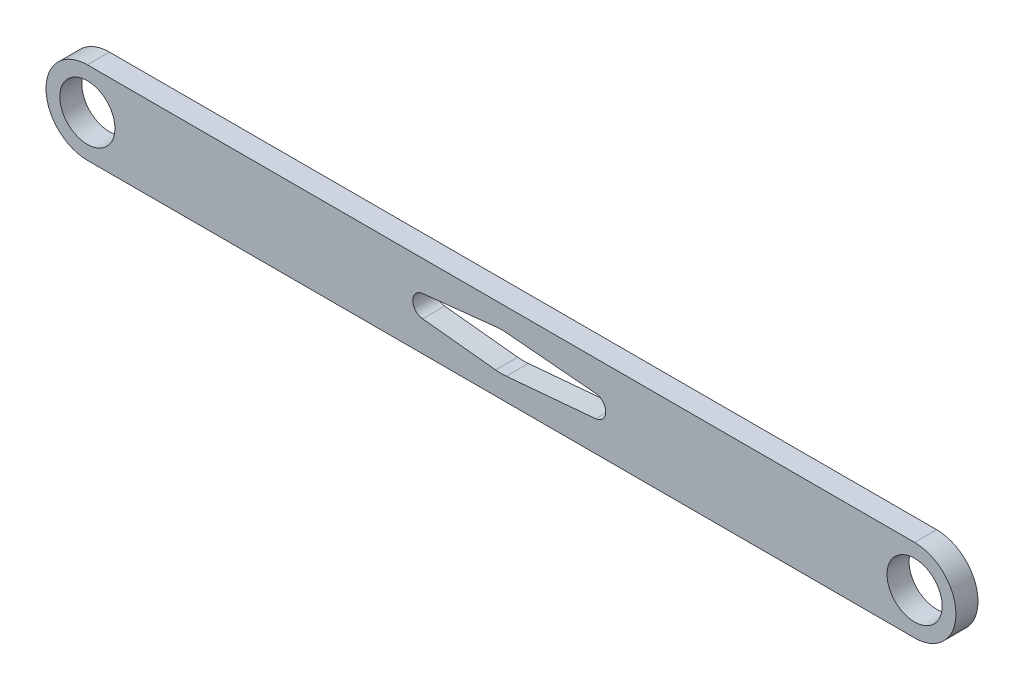
ISO-10303-21;
HEADER;
FILE_DESCRIPTION(('STEP AP214'),'2;1');
FILE_NAME('part.step','',(''),(''),'','','');
FILE_SCHEMA(('AUTOMOTIVE_DESIGN { 1 0 10303 214 1 1 1 1 }'));
ENDSEC;
DATA;
#1=APPLICATION_CONTEXT('core data for automotive mechanical design processes');
#2=APPLICATION_PROTOCOL_DEFINITION('international standard','automotive_design',2000,#1);
#3=PRODUCT_CONTEXT('',#1,'mechanical');
#4=PRODUCT('Part','Part','',(#3));
#5=PRODUCT_RELATED_PRODUCT_CATEGORY('part','',(#4));
#6=PRODUCT_DEFINITION_FORMATION('','',#4);
#7=PRODUCT_DEFINITION_CONTEXT('part definition',#1,'design');
#8=PRODUCT_DEFINITION('design','',#6,#7);
#9=PRODUCT_DEFINITION_SHAPE('','',#8);
#10=(LENGTH_UNIT() NAMED_UNIT(*) SI_UNIT(.MILLI.,.METRE.));
#11=(NAMED_UNIT(*) PLANE_ANGLE_UNIT() SI_UNIT($,.RADIAN.));
#12=(NAMED_UNIT(*) SI_UNIT($,.STERADIAN.) SOLID_ANGLE_UNIT());
#13=UNCERTAINTY_MEASURE_WITH_UNIT(LENGTH_MEASURE(1.E-05),#10,'distance_accuracy_value','');
#14=(GEOMETRIC_REPRESENTATION_CONTEXT(3) GLOBAL_UNCERTAINTY_ASSIGNED_CONTEXT((#13)) GLOBAL_UNIT_ASSIGNED_CONTEXT((#10,
#11,#12)) REPRESENTATION_CONTEXT('',''));
#15=CARTESIAN_POINT('',(0.,0.,0.));
#16=DIRECTION('',(0.,0.,1.));
#17=DIRECTION('',(1.,0.,0.));
#18=AXIS2_PLACEMENT_3D('',#15,#16,#17);
#19=CARTESIAN_POINT('',(75.,0.,4.));
#20=DIRECTION('',(0.,0.,1.));
#21=DIRECTION('',(1.,0.,0.));
#22=AXIS2_PLACEMENT_3D('',#19,#20,#21);
#23=PLANE('',#22);
#24=CARTESIAN_POINT('',(75.,0.,4.));
#25=DIRECTION('',(0.,0.,1.));
#26=DIRECTION('',(1.,0.,0.));
#27=AXIS2_PLACEMENT_3D('',#24,#25,#26);
#28=CIRCLE('',#27,5.);
#29=CARTESIAN_POINT('',(80.,0.,4.));
#30=VERTEX_POINT('',#29);
#31=EDGE_CURVE('E197',#30,#30,#28,.T.);
#32=ORIENTED_EDGE('',*,*,#31,.F.);
#33=EDGE_LOOP('',(#32));
#34=FACE_BOUND('',#33,.T.);
#35=CARTESIAN_POINT('',(75.,0.,4.));
#36=DIRECTION('',(0.,0.,1.));
#37=DIRECTION('',(1.,0.,0.));
#38=AXIS2_PLACEMENT_3D('',#35,#36,#37);
#39=CIRCLE('',#38,7.5);
#40=CARTESIAN_POINT('',(75.,-7.50000000000002,4.));
#41=VERTEX_POINT('',#40);
#42=CARTESIAN_POINT('',(75.,7.49999999999998,4.));
#43=VERTEX_POINT('',#42);
#44=EDGE_CURVE('E203',#41,#43,#39,.T.);
#45=ORIENTED_EDGE('',*,*,#44,.T.);
#46=DIRECTION('',(-1.,0.,0.));
#47=VECTOR('',#46,1.);
#48=CARTESIAN_POINT('',(75.,7.49999999999998,4.));
#49=LINE('',#48,#47);
#50=CARTESIAN_POINT('',(-75.,7.50000000000003,4.));
#51=VERTEX_POINT('',#50);
#52=EDGE_CURVE('E206',#43,#51,#49,.T.);
#53=ORIENTED_EDGE('',*,*,#52,.T.);
#54=CARTESIAN_POINT('',(-75.,0.,4.));
#55=DIRECTION('',(0.,0.,1.));
#56=DIRECTION('',(1.,0.,0.));
#57=AXIS2_PLACEMENT_3D('',#54,#55,#56);
#58=CIRCLE('',#57,7.5);
#59=CARTESIAN_POINT('',(-75.,-7.50000000000004,4.));
#60=VERTEX_POINT('',#59);
#61=EDGE_CURVE('E209',#51,#60,#58,.T.);
#62=ORIENTED_EDGE('',*,*,#61,.T.);
#63=DIRECTION('',(1.,0.,0.));
#64=VECTOR('',#63,1.);
#65=CARTESIAN_POINT('',(75.,-7.50000000000002,4.));
#66=LINE('',#65,#64);
#67=EDGE_CURVE('E211',#60,#41,#66,.T.);
#68=ORIENTED_EDGE('',*,*,#67,.T.);
#69=EDGE_LOOP('',(#45,#53,#62,#68));
#70=FACE_BOUND('',#69,.T.);
#71=CARTESIAN_POINT('',(-75.,0.,4.));
#72=DIRECTION('',(0.,0.,1.));
#73=DIRECTION('',(-1.,0.,0.));
#74=AXIS2_PLACEMENT_3D('',#71,#72,#73);
#75=CIRCLE('',#74,5.);
#76=CARTESIAN_POINT('',(-80.,0.,4.));
#77=VERTEX_POINT('',#76);
#78=EDGE_CURVE('E191',#77,#77,#75,.T.);
#79=ORIENTED_EDGE('',*,*,#78,.F.);
#80=EDGE_LOOP('',(#79));
#81=FACE_BOUND('',#80,.T.);
#82=DIRECTION('',(-0.994393675829005,-0.105741276100109,0.));
#83=VECTOR('',#82,1.);
#84=CARTESIAN_POINT('',(-0.965077795265282,3.39737609953909,4.));
#85=LINE('',#84,#83);
#86=CARTESIAN_POINT('',(-0.965077795265282,3.39737609953909,4.));
#87=VERTEX_POINT('',#86);
#88=CARTESIAN_POINT('',(-14.2114825522002,1.988787351658,4.));
#89=VERTEX_POINT('',#88);
#90=EDGE_CURVE('E134',#87,#89,#85,.T.);
#91=ORIENTED_EDGE('',*,*,#90,.F.);
#92=CARTESIAN_POINT('',(0.0923349657358066,-6.54656065875096,4.));
#93=DIRECTION('',(0.,0.,1.));
#94=DIRECTION('',(1.,0.,0.));
#95=AXIS2_PLACEMENT_3D('',#92,#93,#94);
#96=CIRCLE('',#95,10.);
#97=CARTESIAN_POINT('',(0.966800983112849,3.41513142565181,4.));
#98=VERTEX_POINT('',#97);
#99=EDGE_CURVE('E126',#98,#87,#96,.T.);
#100=ORIENTED_EDGE('',*,*,#99,.F.);
#101=DIRECTION('',(-0.996169208440277,0.0874466017377044,0.));
#102=VECTOR('',#101,1.);
#103=CARTESIAN_POINT('',(0.966800983112849,3.41513142565181,4.));
#104=LINE('',#103,#102);
#105=CARTESIAN_POINT('',(17.1748932034754,1.99233841688055,4.));
#106=VERTEX_POINT('',#105);
#107=EDGE_CURVE('E159',#106,#98,#104,.T.);
#108=ORIENTED_EDGE('',*,*,#107,.F.);
#109=CARTESIAN_POINT('',(17.,0.,4.));
#110=DIRECTION('',(0.,0.,1.));
#111=DIRECTION('',(-1.,0.,0.));
#112=AXIS2_PLACEMENT_3D('',#109,#110,#111);
#113=CIRCLE('',#112,2.);
#114=CARTESIAN_POINT('',(17.1748932034754,-1.99233841688056,4.));
#115=VERTEX_POINT('',#114);
#116=EDGE_CURVE('E157',#115,#106,#113,.T.);
#117=ORIENTED_EDGE('',*,*,#116,.F.);
#118=DIRECTION('',(0.996169208440277,0.0874466017377038,0.));
#119=VECTOR('',#118,1.);
#120=CARTESIAN_POINT('',(0.966800983112841,-3.41513142565181,4.));
#121=LINE('',#120,#119);
#122=CARTESIAN_POINT('',(0.966800983112841,-3.41513142565181,4.));
#123=VERTEX_POINT('',#122);
#124=EDGE_CURVE('E155',#123,#115,#121,.T.);
#125=ORIENTED_EDGE('',*,*,#124,.F.);
#126=CARTESIAN_POINT('',(0.0923349657358031,6.54656065875096,4.));
#127=DIRECTION('',(0.,0.,1.));
#128=DIRECTION('',(1.,0.,0.));
#129=AXIS2_PLACEMENT_3D('',#126,#127,#128);
#130=CIRCLE('',#129,10.);
#131=CARTESIAN_POINT('',(-0.965077795265273,-3.3973760995391,4.));
#132=VERTEX_POINT('',#131);
#133=EDGE_CURVE('E153',#132,#123,#130,.T.);
#134=ORIENTED_EDGE('',*,*,#133,.F.);
#135=DIRECTION('',(0.994393675829005,-0.105741276100108,0.));
#136=VECTOR('',#135,1.);
#137=CARTESIAN_POINT('',(-0.965077795265276,-3.3973760995391,4.));
#138=LINE('',#137,#136);
#139=CARTESIAN_POINT('',(-14.2114825522002,-1.98878735165802,4.));
#140=VERTEX_POINT('',#139);
#141=EDGE_CURVE('E149',#140,#132,#138,.T.);
#142=ORIENTED_EDGE('',*,*,#141,.F.);
#143=CARTESIAN_POINT('',(-14.,0.,4.));
#144=DIRECTION('',(0.,0.,1.));
#145=DIRECTION('',(1.,0.,0.));
#146=AXIS2_PLACEMENT_3D('',#143,#144,#145);
#147=CIRCLE('',#146,2.);
#148=EDGE_CURVE('E147',#89,#140,#147,.T.);
#149=ORIENTED_EDGE('',*,*,#148,.F.);
#150=EDGE_LOOP('',(#91,#100,#108,#117,#125,#134,#142,#149));
#151=FACE_BOUND('',#150,.T.);
#152=ADVANCED_FACE('F37',(#34,#70,#81,#151),#23,.T.);
#153=CARTESIAN_POINT('',(75.,0.,0.));
#154=DIRECTION('',(0.,0.,1.));
#155=DIRECTION('',(1.,0.,0.));
#156=AXIS2_PLACEMENT_3D('',#153,#154,#155);
#157=PLANE('',#156);
#158=CARTESIAN_POINT('',(-75.,0.,0.));
#159=DIRECTION('',(0.,0.,1.));
#160=DIRECTION('',(-1.,0.,0.));
#161=AXIS2_PLACEMENT_3D('',#158,#159,#160);
#162=CIRCLE('',#161,5.);
#163=CARTESIAN_POINT('',(-80.,0.,0.));
#164=VERTEX_POINT('',#163);
#165=EDGE_CURVE('E142',#164,#164,#162,.T.);
#166=ORIENTED_EDGE('',*,*,#165,.T.);
#167=EDGE_LOOP('',(#166));
#168=FACE_BOUND('',#167,.T.);
#169=CARTESIAN_POINT('',(75.,0.,0.));
#170=DIRECTION('',(0.,0.,1.));
#171=DIRECTION('',(1.,0.,0.));
#172=AXIS2_PLACEMENT_3D('',#169,#170,#171);
#173=CIRCLE('',#172,5.);
#174=CARTESIAN_POINT('',(80.,0.,0.));
#175=VERTEX_POINT('',#174);
#176=EDGE_CURVE('E194',#175,#175,#173,.T.);
#177=ORIENTED_EDGE('',*,*,#176,.T.);
#178=EDGE_LOOP('',(#177));
#179=FACE_BOUND('',#178,.T.);
#180=CARTESIAN_POINT('',(75.,0.,0.));
#181=DIRECTION('',(0.,0.,1.));
#182=DIRECTION('',(1.,0.,0.));
#183=AXIS2_PLACEMENT_3D('',#180,#181,#182);
#184=CIRCLE('',#183,7.5);
#185=CARTESIAN_POINT('',(75.,-7.50000000000002,0.));
#186=VERTEX_POINT('',#185);
#187=CARTESIAN_POINT('',(75.,7.49999999999998,0.));
#188=VERTEX_POINT('',#187);
#189=EDGE_CURVE('E200',#186,#188,#184,.T.);
#190=ORIENTED_EDGE('',*,*,#189,.F.);
#191=DIRECTION('',(1.,0.,0.));
#192=VECTOR('',#191,1.);
#193=CARTESIAN_POINT('',(75.,-7.50000000000002,0.));
#194=LINE('',#193,#192);
#195=CARTESIAN_POINT('',(-75.,-7.50000000000004,0.));
#196=VERTEX_POINT('',#195);
#197=EDGE_CURVE('E207',#196,#186,#194,.T.);
#198=ORIENTED_EDGE('',*,*,#197,.F.);
#199=CARTESIAN_POINT('',(-75.,0.,0.));
#200=DIRECTION('',(0.,0.,1.));
#201=DIRECTION('',(1.,0.,0.));
#202=AXIS2_PLACEMENT_3D('',#199,#200,#201);
#203=CIRCLE('',#202,7.5);
#204=CARTESIAN_POINT('',(-75.,7.50000000000003,0.));
#205=VERTEX_POINT('',#204);
#206=EDGE_CURVE('E218',#205,#196,#203,.T.);
#207=ORIENTED_EDGE('',*,*,#206,.F.);
#208=DIRECTION('',(-1.,0.,0.));
#209=VECTOR('',#208,1.);
#210=CARTESIAN_POINT('',(75.,7.49999999999998,0.));
#211=LINE('',#210,#209);
#212=EDGE_CURVE('E216',#188,#205,#211,.T.);
#213=ORIENTED_EDGE('',*,*,#212,.F.);
#214=EDGE_LOOP('',(#190,#198,#207,#213));
#215=FACE_BOUND('',#214,.T.);
#216=CARTESIAN_POINT('',(0.0923349657358066,-6.54656065875096,0.));
#217=DIRECTION('',(0.,0.,1.));
#218=DIRECTION('',(1.,0.,0.));
#219=AXIS2_PLACEMENT_3D('',#216,#217,#218);
#220=CIRCLE('',#219,10.);
#221=CARTESIAN_POINT('',(0.966800983112831,3.41513142565182,0.));
#222=VERTEX_POINT('',#221);
#223=CARTESIAN_POINT('',(-0.965077795265282,3.39737609953909,0.));
#224=VERTEX_POINT('',#223);
#225=EDGE_CURVE('E60',#222,#224,#220,.T.);
#226=ORIENTED_EDGE('',*,*,#225,.T.);
#227=DIRECTION('',(-0.994393675829005,-0.105741276100109,0.));
#228=VECTOR('',#227,1.);
#229=CARTESIAN_POINT('',(-0.965077795265282,3.39737609953909,0.));
#230=LINE('',#229,#228);
#231=CARTESIAN_POINT('',(-14.2114825522002,1.988787351658,0.));
#232=VERTEX_POINT('',#231);
#233=EDGE_CURVE('E141',#224,#232,#230,.T.);
#234=ORIENTED_EDGE('',*,*,#233,.T.);
#235=CARTESIAN_POINT('',(-14.,0.,0.));
#236=DIRECTION('',(0.,0.,1.));
#237=DIRECTION('',(1.,0.,0.));
#238=AXIS2_PLACEMENT_3D('',#235,#236,#237);
#239=CIRCLE('',#238,2.);
#240=CARTESIAN_POINT('',(-14.2114825522002,-1.98878735165802,0.));
#241=VERTEX_POINT('',#240);
#242=EDGE_CURVE('E163',#232,#241,#239,.T.);
#243=ORIENTED_EDGE('',*,*,#242,.T.);
#244=DIRECTION('',(0.994393675829005,-0.105741276100108,0.));
#245=VECTOR('',#244,1.);
#246=CARTESIAN_POINT('',(-0.965077795265276,-3.3973760995391,0.));
#247=LINE('',#246,#245);
#248=CARTESIAN_POINT('',(-0.965077795265273,-3.3973760995391,0.));
#249=VERTEX_POINT('',#248);
#250=EDGE_CURVE('E166',#241,#249,#247,.T.);
#251=ORIENTED_EDGE('',*,*,#250,.T.);
#252=CARTESIAN_POINT('',(0.0923349657358031,6.54656065875096,0.));
#253=DIRECTION('',(0.,0.,1.));
#254=DIRECTION('',(1.,0.,0.));
#255=AXIS2_PLACEMENT_3D('',#252,#253,#254);
#256=CIRCLE('',#255,10.);
#257=CARTESIAN_POINT('',(0.966800983112841,-3.41513142565181,0.));
#258=VERTEX_POINT('',#257);
#259=EDGE_CURVE('E169',#249,#258,#256,.T.);
#260=ORIENTED_EDGE('',*,*,#259,.T.);
#261=DIRECTION('',(0.996169208440277,0.0874466017377038,0.));
#262=VECTOR('',#261,1.);
#263=CARTESIAN_POINT('',(0.966800983112841,-3.41513142565181,0.));
#264=LINE('',#263,#262);
#265=CARTESIAN_POINT('',(17.1748932034754,-1.99233841688056,0.));
#266=VERTEX_POINT('',#265);
#267=EDGE_CURVE('E172',#258,#266,#264,.T.);
#268=ORIENTED_EDGE('',*,*,#267,.T.);
#269=CARTESIAN_POINT('',(17.,0.,0.));
#270=DIRECTION('',(0.,0.,1.));
#271=DIRECTION('',(-1.,0.,0.));
#272=AXIS2_PLACEMENT_3D('',#269,#270,#271);
#273=CIRCLE('',#272,2.);
#274=CARTESIAN_POINT('',(17.1748932034754,1.99233841688055,0.));
#275=VERTEX_POINT('',#274);
#276=EDGE_CURVE('E175',#266,#275,#273,.T.);
#277=ORIENTED_EDGE('',*,*,#276,.T.);
#278=DIRECTION('',(-0.996169208440277,0.0874466017377044,0.));
#279=VECTOR('',#278,1.);
#280=CARTESIAN_POINT('',(0.966800983112849,3.41513142565181,0.));
#281=LINE('',#280,#279);
#282=EDGE_CURVE('E135',#275,#222,#281,.T.);
#283=ORIENTED_EDGE('',*,*,#282,.T.);
#284=EDGE_LOOP('',(#226,#234,#243,#251,#260,#268,#277,#283));
#285=FACE_BOUND('',#284,.T.);
#286=ADVANCED_FACE('F236',(#168,#179,#215,#285),#157,.F.);
#287=CARTESIAN_POINT('',(75.,0.,4.));
#288=DIRECTION('',(0.,0.,-1.));
#289=DIRECTION('',(-1.,0.,0.));
#290=AXIS2_PLACEMENT_3D('',#287,#288,#289);
#291=CYLINDRICAL_SURFACE('',#290,7.5);
#292=ORIENTED_EDGE('',*,*,#189,.T.);
#293=DIRECTION('',(0.,0.,-1.));
#294=VECTOR('',#293,1.);
#295=CARTESIAN_POINT('',(75.,7.49999999999998,4.));
#296=LINE('',#295,#294);
#297=EDGE_CURVE('E11',#43,#188,#296,.T.);
#298=ORIENTED_EDGE('',*,*,#297,.F.);
#299=ORIENTED_EDGE('',*,*,#44,.F.);
#300=DIRECTION('',(0.,0.,-1.));
#301=VECTOR('',#300,1.);
#302=CARTESIAN_POINT('',(75.,-7.50000000000002,4.));
#303=LINE('',#302,#301);
#304=EDGE_CURVE('E213',#41,#186,#303,.T.);
#305=ORIENTED_EDGE('',*,*,#304,.T.);
#306=EDGE_LOOP('',(#292,#298,#299,#305));
#307=FACE_BOUND('',#306,.T.);
#308=ADVANCED_FACE('F39',(#307),#291,.T.);
#309=CARTESIAN_POINT('',(75.,7.49999999999998,4.));
#310=DIRECTION('',(0.,-1.,0.));
#311=DIRECTION('',(1.,0.,0.));
#312=AXIS2_PLACEMENT_3D('',#309,#310,#311);
#313=PLANE('',#312);
#314=ORIENTED_EDGE('',*,*,#212,.T.);
#315=DIRECTION('',(0.,0.,-1.));
#316=VECTOR('',#315,1.);
#317=CARTESIAN_POINT('',(-75.,7.50000000000003,4.));
#318=LINE('',#317,#316);
#319=EDGE_CURVE('E45',#51,#205,#318,.T.);
#320=ORIENTED_EDGE('',*,*,#319,.F.);
#321=ORIENTED_EDGE('',*,*,#52,.F.);
#322=ORIENTED_EDGE('',*,*,#297,.T.);
#323=EDGE_LOOP('',(#314,#320,#321,#322));
#324=FACE_BOUND('',#323,.T.);
#325=ADVANCED_FACE('F247',(#324),#313,.F.);
#326=CARTESIAN_POINT('',(-75.,0.,4.));
#327=DIRECTION('',(0.,0.,-1.));
#328=DIRECTION('',(-1.,0.,0.));
#329=AXIS2_PLACEMENT_3D('',#326,#327,#328);
#330=CYLINDRICAL_SURFACE('',#329,7.5);
#331=ORIENTED_EDGE('',*,*,#206,.T.);
#332=DIRECTION('',(0.,0.,-1.));
#333=VECTOR('',#332,1.);
#334=CARTESIAN_POINT('',(-75.,-7.50000000000004,4.));
#335=LINE('',#334,#333);
#336=EDGE_CURVE('E223',#60,#196,#335,.T.);
#337=ORIENTED_EDGE('',*,*,#336,.F.);
#338=ORIENTED_EDGE('',*,*,#61,.F.);
#339=ORIENTED_EDGE('',*,*,#319,.T.);
#340=EDGE_LOOP('',(#331,#337,#338,#339));
#341=FACE_BOUND('',#340,.T.);
#342=ADVANCED_FACE('F230',(#341),#330,.T.);
#343=CARTESIAN_POINT('',(75.,-7.50000000000002,4.));
#344=DIRECTION('',(0.,1.,0.));
#345=DIRECTION('',(-1.,0.,0.));
#346=AXIS2_PLACEMENT_3D('',#343,#344,#345);
#347=PLANE('',#346);
#348=ORIENTED_EDGE('',*,*,#197,.T.);
#349=ORIENTED_EDGE('',*,*,#304,.F.);
#350=ORIENTED_EDGE('',*,*,#67,.F.);
#351=ORIENTED_EDGE('',*,*,#336,.T.);
#352=EDGE_LOOP('',(#348,#349,#350,#351));
#353=FACE_BOUND('',#352,.T.);
#354=ADVANCED_FACE('F240',(#353),#347,.F.);
#355=CARTESIAN_POINT('',(75.,0.,4.));
#356=DIRECTION('',(0.,0.,-1.));
#357=DIRECTION('',(-1.,0.,0.));
#358=AXIS2_PLACEMENT_3D('',#355,#356,#357);
#359=CYLINDRICAL_SURFACE('',#358,5.);
#360=ORIENTED_EDGE('',*,*,#31,.T.);
#361=EDGE_LOOP('',(#360));
#362=FACE_BOUND('',#361,.T.);
#363=ORIENTED_EDGE('',*,*,#176,.F.);
#364=EDGE_LOOP('',(#363));
#365=FACE_BOUND('',#364,.T.);
#366=ADVANCED_FACE('F264',(#362,#365),#359,.F.);
#367=CARTESIAN_POINT('',(-75.,0.,4.));
#368=DIRECTION('',(0.,0.,-1.));
#369=DIRECTION('',(-1.,0.,0.));
#370=AXIS2_PLACEMENT_3D('',#367,#368,#369);
#371=CYLINDRICAL_SURFACE('',#370,5.);
#372=ORIENTED_EDGE('',*,*,#78,.T.);
#373=EDGE_LOOP('',(#372));
#374=FACE_BOUND('',#373,.T.);
#375=ORIENTED_EDGE('',*,*,#165,.F.);
#376=EDGE_LOOP('',(#375));
#377=FACE_BOUND('',#376,.T.);
#378=ADVANCED_FACE('F271',(#374,#377),#371,.F.);
#379=CARTESIAN_POINT('',(0.0923349657358066,-6.54656065875096,4.));
#380=DIRECTION('',(0.,0.,-1.));
#381=DIRECTION('',(-1.,0.,0.));
#382=AXIS2_PLACEMENT_3D('',#379,#380,#381);
#383=CYLINDRICAL_SURFACE('',#382,10.);
#384=ORIENTED_EDGE('',*,*,#225,.F.);
#385=DIRECTION('',(0.,0.,-1.));
#386=VECTOR('',#385,1.);
#387=CARTESIAN_POINT('',(0.966800983112849,3.41513142565181,4.));
#388=LINE('',#387,#386);
#389=EDGE_CURVE('E130',#98,#222,#388,.T.);
#390=ORIENTED_EDGE('',*,*,#389,.F.);
#391=ORIENTED_EDGE('',*,*,#99,.T.);
#392=DIRECTION('',(0.,0.,-1.));
#393=VECTOR('',#392,1.);
#394=CARTESIAN_POINT('',(-0.965077795265282,3.39737609953909,4.));
#395=LINE('',#394,#393);
#396=EDGE_CURVE('E129',#87,#224,#395,.T.);
#397=ORIENTED_EDGE('',*,*,#396,.T.);
#398=EDGE_LOOP('',(#384,#390,#391,#397));
#399=FACE_BOUND('',#398,.T.);
#400=ADVANCED_FACE('F128',(#399),#383,.F.);
#401=CARTESIAN_POINT('',(-0.965077795265282,3.39737609953909,4.));
#402=DIRECTION('',(0.105741276100109,-0.994393675829005,0.));
#403=DIRECTION('',(0.994393675829005,0.105741276100109,0.));
#404=AXIS2_PLACEMENT_3D('',#401,#402,#403);
#405=PLANE('',#404);
#406=ORIENTED_EDGE('',*,*,#233,.F.);
#407=ORIENTED_EDGE('',*,*,#396,.F.);
#408=ORIENTED_EDGE('',*,*,#90,.T.);
#409=DIRECTION('',(0.,0.,-1.));
#410=VECTOR('',#409,1.);
#411=CARTESIAN_POINT('',(-14.2114825522002,1.988787351658,4.));
#412=LINE('',#411,#410);
#413=EDGE_CURVE('E143',#89,#232,#412,.T.);
#414=ORIENTED_EDGE('',*,*,#413,.T.);
#415=EDGE_LOOP('',(#406,#407,#408,#414));
#416=FACE_BOUND('',#415,.T.);
#417=ADVANCED_FACE('F138',(#416),#405,.T.);
#418=CARTESIAN_POINT('',(-14.,0.,4.));
#419=DIRECTION('',(0.,0.,-1.));
#420=DIRECTION('',(-1.,0.,0.));
#421=AXIS2_PLACEMENT_3D('',#418,#419,#420);
#422=CYLINDRICAL_SURFACE('',#421,2.);
#423=ORIENTED_EDGE('',*,*,#242,.F.);
#424=ORIENTED_EDGE('',*,*,#413,.F.);
#425=ORIENTED_EDGE('',*,*,#148,.T.);
#426=DIRECTION('',(0.,0.,-1.));
#427=VECTOR('',#426,1.);
#428=CARTESIAN_POINT('',(-14.2114825522002,-1.98878735165802,4.));
#429=LINE('',#428,#427);
#430=EDGE_CURVE('E188',#140,#241,#429,.T.);
#431=ORIENTED_EDGE('',*,*,#430,.T.);
#432=EDGE_LOOP('',(#423,#424,#425,#431));
#433=FACE_BOUND('',#432,.T.);
#434=ADVANCED_FACE('F288',(#433),#422,.F.);
#435=CARTESIAN_POINT('',(-0.965077795265276,-3.3973760995391,4.));
#436=DIRECTION('',(0.105741276100108,0.994393675829005,0.));
#437=DIRECTION('',(-0.994393675829005,0.105741276100108,0.));
#438=AXIS2_PLACEMENT_3D('',#435,#436,#437);
#439=PLANE('',#438);
#440=ORIENTED_EDGE('',*,*,#250,.F.);
#441=ORIENTED_EDGE('',*,*,#430,.F.);
#442=ORIENTED_EDGE('',*,*,#141,.T.);
#443=DIRECTION('',(0.,0.,-1.));
#444=VECTOR('',#443,1.);
#445=CARTESIAN_POINT('',(-0.965077795265273,-3.3973760995391,4.));
#446=LINE('',#445,#444);
#447=EDGE_CURVE('E186',#132,#249,#446,.T.);
#448=ORIENTED_EDGE('',*,*,#447,.T.);
#449=EDGE_LOOP('',(#440,#441,#442,#448));
#450=FACE_BOUND('',#449,.T.);
#451=ADVANCED_FACE('F291',(#450),#439,.T.);
#452=CARTESIAN_POINT('',(0.0923349657358031,6.54656065875096,4.));
#453=DIRECTION('',(0.,0.,-1.));
#454=DIRECTION('',(-1.,0.,0.));
#455=AXIS2_PLACEMENT_3D('',#452,#453,#454);
#456=CYLINDRICAL_SURFACE('',#455,10.);
#457=ORIENTED_EDGE('',*,*,#259,.F.);
#458=ORIENTED_EDGE('',*,*,#447,.F.);
#459=ORIENTED_EDGE('',*,*,#133,.T.);
#460=DIRECTION('',(0.,0.,-1.));
#461=VECTOR('',#460,1.);
#462=CARTESIAN_POINT('',(0.966800983112841,-3.41513142565181,4.));
#463=LINE('',#462,#461);
#464=EDGE_CURVE('E184',#123,#258,#463,.T.);
#465=ORIENTED_EDGE('',*,*,#464,.T.);
#466=EDGE_LOOP('',(#457,#458,#459,#465));
#467=FACE_BOUND('',#466,.T.);
#468=ADVANCED_FACE('F295',(#467),#456,.F.);
#469=CARTESIAN_POINT('',(0.966800983112841,-3.41513142565181,4.));
#470=DIRECTION('',(-0.0874466017377038,0.996169208440277,0.));
#471=DIRECTION('',(-0.996169208440277,-0.0874466017377038,0.));
#472=AXIS2_PLACEMENT_3D('',#469,#470,#471);
#473=PLANE('',#472);
#474=ORIENTED_EDGE('',*,*,#267,.F.);
#475=ORIENTED_EDGE('',*,*,#464,.F.);
#476=ORIENTED_EDGE('',*,*,#124,.T.);
#477=DIRECTION('',(0.,0.,-1.));
#478=VECTOR('',#477,1.);
#479=CARTESIAN_POINT('',(17.1748932034754,-1.99233841688056,4.));
#480=LINE('',#479,#478);
#481=EDGE_CURVE('E182',#115,#266,#480,.T.);
#482=ORIENTED_EDGE('',*,*,#481,.T.);
#483=EDGE_LOOP('',(#474,#475,#476,#482));
#484=FACE_BOUND('',#483,.T.);
#485=ADVANCED_FACE('F299',(#484),#473,.T.);
#486=CARTESIAN_POINT('',(17.,0.,4.));
#487=DIRECTION('',(0.,0.,-1.));
#488=DIRECTION('',(-1.,0.,0.));
#489=AXIS2_PLACEMENT_3D('',#486,#487,#488);
#490=CYLINDRICAL_SURFACE('',#489,2.);
#491=ORIENTED_EDGE('',*,*,#276,.F.);
#492=ORIENTED_EDGE('',*,*,#481,.F.);
#493=ORIENTED_EDGE('',*,*,#116,.T.);
#494=DIRECTION('',(0.,0.,-1.));
#495=VECTOR('',#494,1.);
#496=CARTESIAN_POINT('',(17.1748932034754,1.99233841688055,4.));
#497=LINE('',#496,#495);
#498=EDGE_CURVE('E52',#106,#275,#497,.T.);
#499=ORIENTED_EDGE('',*,*,#498,.T.);
#500=EDGE_LOOP('',(#491,#492,#493,#499));
#501=FACE_BOUND('',#500,.T.);
#502=ADVANCED_FACE('F303',(#501),#490,.F.);
#503=CARTESIAN_POINT('',(0.966800983112849,3.41513142565181,4.));
#504=DIRECTION('',(-0.0874466017377044,-0.996169208440277,0.));
#505=DIRECTION('',(0.996169208440277,-0.0874466017377044,0.));
#506=AXIS2_PLACEMENT_3D('',#503,#504,#505);
#507=PLANE('',#506);
#508=ORIENTED_EDGE('',*,*,#282,.F.);
#509=ORIENTED_EDGE('',*,*,#498,.F.);
#510=ORIENTED_EDGE('',*,*,#107,.T.);
#511=ORIENTED_EDGE('',*,*,#389,.T.);
#512=EDGE_LOOP('',(#508,#509,#510,#511));
#513=FACE_BOUND('',#512,.T.);
#514=ADVANCED_FACE('F307',(#513),#507,.T.);
#515=CLOSED_SHELL('',(#152,#286,#308,#325,#342,#354,#366,#378,#400,#417,#434,#451,#468,#485,
#502,#514));
#516=MANIFOLD_SOLID_BREP('B2',#515);
#517=ADVANCED_BREP_SHAPE_REPRESENTATION('',(#18,#516),#14);
#518=SHAPE_DEFINITION_REPRESENTATION(#9,#517);
ENDSEC;
END-ISO-10303-21;
